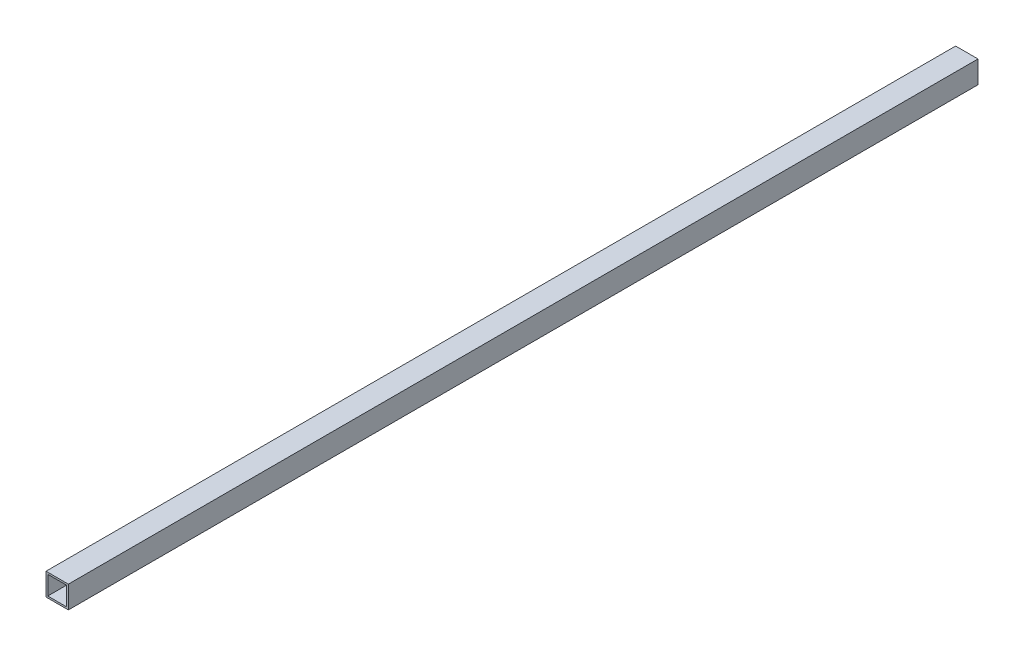
ISO-10303-21;
HEADER;
FILE_DESCRIPTION(('STEP AP214'),'2;1');
FILE_NAME('part.step','',(''),(''),'','','');
FILE_SCHEMA(('AUTOMOTIVE_DESIGN { 1 0 10303 214 1 1 1 1 }'));
ENDSEC;
DATA;
#1=APPLICATION_CONTEXT('core data for automotive mechanical design processes');
#2=APPLICATION_PROTOCOL_DEFINITION('international standard','automotive_design',2000,#1);
#3=PRODUCT_CONTEXT('',#1,'mechanical');
#4=PRODUCT('Part','Part','',(#3));
#5=PRODUCT_RELATED_PRODUCT_CATEGORY('part','',(#4));
#6=PRODUCT_DEFINITION_FORMATION('','',#4);
#7=PRODUCT_DEFINITION_CONTEXT('part definition',#1,'design');
#8=PRODUCT_DEFINITION('design','',#6,#7);
#9=PRODUCT_DEFINITION_SHAPE('','',#8);
#10=(LENGTH_UNIT() NAMED_UNIT(*) SI_UNIT(.MILLI.,.METRE.));
#11=(NAMED_UNIT(*) PLANE_ANGLE_UNIT() SI_UNIT($,.RADIAN.));
#12=(NAMED_UNIT(*) SI_UNIT($,.STERADIAN.) SOLID_ANGLE_UNIT());
#13=UNCERTAINTY_MEASURE_WITH_UNIT(LENGTH_MEASURE(1.E-05),#10,'distance_accuracy_value','');
#14=(GEOMETRIC_REPRESENTATION_CONTEXT(3) GLOBAL_UNCERTAINTY_ASSIGNED_CONTEXT((#13)) GLOBAL_UNIT_ASSIGNED_CONTEXT((#10,
#11,#12)) REPRESENTATION_CONTEXT('',''));
#15=CARTESIAN_POINT('',(0.,0.,0.));
#16=DIRECTION('',(0.,0.,1.));
#17=DIRECTION('',(1.,0.,0.));
#18=AXIS2_PLACEMENT_3D('',#15,#16,#17);
#19=CARTESIAN_POINT('',(0.,0.,610.));
#20=DIRECTION('',(0.,0.,-1.));
#21=DIRECTION('',(-1.,0.,0.));
#22=AXIS2_PLACEMENT_3D('',#19,#20,#21);
#23=PLANE('',#22);
#24=DIRECTION('',(0.,1.,0.));
#25=VECTOR('',#24,1.);
#26=CARTESIAN_POINT('',(7.5,-7.5,610.));
#27=LINE('',#26,#25);
#28=CARTESIAN_POINT('',(7.5,-7.5,610.));
#29=VERTEX_POINT('',#28);
#30=CARTESIAN_POINT('',(7.5,7.5,610.));
#31=VERTEX_POINT('',#30);
#32=EDGE_CURVE('E153',#29,#31,#27,.T.);
#33=ORIENTED_EDGE('',*,*,#32,.T.);
#34=DIRECTION('',(-1.,0.,0.));
#35=VECTOR('',#34,1.);
#36=CARTESIAN_POINT('',(-7.5,7.5,610.));
#37=LINE('',#36,#35);
#38=CARTESIAN_POINT('',(-7.5,7.5,610.));
#39=VERTEX_POINT('',#38);
#40=EDGE_CURVE('E157',#31,#39,#37,.T.);
#41=ORIENTED_EDGE('',*,*,#40,.T.);
#42=DIRECTION('',(0.,-1.,0.));
#43=VECTOR('',#42,1.);
#44=CARTESIAN_POINT('',(-7.5,-7.5,610.));
#45=LINE('',#44,#43);
#46=CARTESIAN_POINT('',(-7.5,-7.5,610.));
#47=VERTEX_POINT('',#46);
#48=EDGE_CURVE('E161',#39,#47,#45,.T.);
#49=ORIENTED_EDGE('',*,*,#48,.T.);
#50=DIRECTION('',(1.,0.,0.));
#51=VECTOR('',#50,1.);
#52=CARTESIAN_POINT('',(-7.5,-7.5,610.));
#53=LINE('',#52,#51);
#54=EDGE_CURVE('E164',#47,#29,#53,.T.);
#55=ORIENTED_EDGE('',*,*,#54,.T.);
#56=EDGE_LOOP('',(#33,#41,#49,#55));
#57=FACE_BOUND('',#56,.T.);
#58=DIRECTION('',(1.,0.,0.));
#59=VECTOR('',#58,1.);
#60=CARTESIAN_POINT('',(-6.3,-6.3,610.));
#61=LINE('',#60,#59);
#62=CARTESIAN_POINT('',(-6.3,-6.3,610.));
#63=VERTEX_POINT('',#62);
#64=CARTESIAN_POINT('',(6.3,-6.3,610.));
#65=VERTEX_POINT('',#64);
#66=EDGE_CURVE('E105',#63,#65,#61,.T.);
#67=ORIENTED_EDGE('',*,*,#66,.F.);
#68=DIRECTION('',(0.,-1.,0.));
#69=VECTOR('',#68,1.);
#70=CARTESIAN_POINT('',(-6.3,-6.3,610.));
#71=LINE('',#70,#69);
#72=CARTESIAN_POINT('',(-6.3,6.3,610.));
#73=VERTEX_POINT('',#72);
#74=EDGE_CURVE('E131',#73,#63,#71,.T.);
#75=ORIENTED_EDGE('',*,*,#74,.F.);
#76=DIRECTION('',(-1.,0.,0.));
#77=VECTOR('',#76,1.);
#78=CARTESIAN_POINT('',(-6.3,6.3,610.));
#79=LINE('',#78,#77);
#80=CARTESIAN_POINT('',(6.3,6.3,610.));
#81=VERTEX_POINT('',#80);
#82=EDGE_CURVE('E127',#81,#73,#79,.T.);
#83=ORIENTED_EDGE('',*,*,#82,.F.);
#84=DIRECTION('',(0.,1.,0.));
#85=VECTOR('',#84,1.);
#86=CARTESIAN_POINT('',(6.3,-6.3,610.));
#87=LINE('',#86,#85);
#88=EDGE_CURVE('E114',#65,#81,#87,.T.);
#89=ORIENTED_EDGE('',*,*,#88,.F.);
#90=EDGE_LOOP('',(#67,#75,#83,#89));
#91=FACE_BOUND('',#90,.T.);
#92=ADVANCED_FACE('F39',(#57,#91),#23,.F.);
#93=CARTESIAN_POINT('',(0.,0.,0.));
#94=DIRECTION('',(0.,0.,-1.));
#95=DIRECTION('',(-1.,0.,0.));
#96=AXIS2_PLACEMENT_3D('',#93,#94,#95);
#97=PLANE('',#96);
#98=DIRECTION('',(0.,1.,0.));
#99=VECTOR('',#98,1.);
#100=CARTESIAN_POINT('',(7.5,-7.5,0.));
#101=LINE('',#100,#99);
#102=CARTESIAN_POINT('',(7.5,-7.5,0.));
#103=VERTEX_POINT('',#102);
#104=CARTESIAN_POINT('',(7.5,7.5,0.));
#105=VERTEX_POINT('',#104);
#106=EDGE_CURVE('E123',#103,#105,#101,.T.);
#107=ORIENTED_EDGE('',*,*,#106,.F.);
#108=DIRECTION('',(1.,0.,0.));
#109=VECTOR('',#108,1.);
#110=CARTESIAN_POINT('',(-7.5,-7.5,0.));
#111=LINE('',#110,#109);
#112=CARTESIAN_POINT('',(-7.5,-7.5,0.));
#113=VERTEX_POINT('',#112);
#114=EDGE_CURVE('E158',#113,#103,#111,.T.);
#115=ORIENTED_EDGE('',*,*,#114,.F.);
#116=DIRECTION('',(0.,-1.,0.));
#117=VECTOR('',#116,1.);
#118=CARTESIAN_POINT('',(-7.5,-7.5,0.));
#119=LINE('',#118,#117);
#120=CARTESIAN_POINT('',(-7.5,7.5,0.));
#121=VERTEX_POINT('',#120);
#122=EDGE_CURVE('E174',#121,#113,#119,.T.);
#123=ORIENTED_EDGE('',*,*,#122,.F.);
#124=DIRECTION('',(-1.,0.,0.));
#125=VECTOR('',#124,1.);
#126=CARTESIAN_POINT('',(-7.5,7.5,0.));
#127=LINE('',#126,#125);
#128=EDGE_CURVE('E171',#105,#121,#127,.T.);
#129=ORIENTED_EDGE('',*,*,#128,.F.);
#130=EDGE_LOOP('',(#107,#115,#123,#129));
#131=FACE_BOUND('',#130,.T.);
#132=DIRECTION('',(0.,-1.,0.));
#133=VECTOR('',#132,1.);
#134=CARTESIAN_POINT('',(-6.3,-6.3,0.));
#135=LINE('',#134,#133);
#136=CARTESIAN_POINT('',(-6.3,6.3,0.));
#137=VERTEX_POINT('',#136);
#138=CARTESIAN_POINT('',(-6.3,-6.3,0.));
#139=VERTEX_POINT('',#138);
#140=EDGE_CURVE('E115',#137,#139,#135,.T.);
#141=ORIENTED_EDGE('',*,*,#140,.T.);
#142=DIRECTION('',(1.,0.,0.));
#143=VECTOR('',#142,1.);
#144=CARTESIAN_POINT('',(-6.3,-6.3,0.));
#145=LINE('',#144,#143);
#146=CARTESIAN_POINT('',(6.3,-6.3,0.));
#147=VERTEX_POINT('',#146);
#148=EDGE_CURVE('E63',#139,#147,#145,.T.);
#149=ORIENTED_EDGE('',*,*,#148,.T.);
#150=DIRECTION('',(0.,1.,0.));
#151=VECTOR('',#150,1.);
#152=CARTESIAN_POINT('',(6.3,-6.3,0.));
#153=LINE('',#152,#151);
#154=CARTESIAN_POINT('',(6.3,6.3,0.));
#155=VERTEX_POINT('',#154);
#156=EDGE_CURVE('E121',#147,#155,#153,.T.);
#157=ORIENTED_EDGE('',*,*,#156,.T.);
#158=DIRECTION('',(-1.,0.,0.));
#159=VECTOR('',#158,1.);
#160=CARTESIAN_POINT('',(-6.3,6.3,0.));
#161=LINE('',#160,#159);
#162=EDGE_CURVE('E140',#155,#137,#161,.T.);
#163=ORIENTED_EDGE('',*,*,#162,.T.);
#164=EDGE_LOOP('',(#141,#149,#157,#163));
#165=FACE_BOUND('',#164,.T.);
#166=ADVANCED_FACE('F197',(#131,#165),#97,.T.);
#167=CARTESIAN_POINT('',(7.5,-7.5,610.));
#168=DIRECTION('',(-1.,0.,0.));
#169=DIRECTION('',(0.,0.,1.));
#170=AXIS2_PLACEMENT_3D('',#167,#168,#169);
#171=PLANE('',#170);
#172=ORIENTED_EDGE('',*,*,#106,.T.);
#173=DIRECTION('',(0.,0.,-1.));
#174=VECTOR('',#173,1.);
#175=CARTESIAN_POINT('',(7.5,7.5,610.));
#176=LINE('',#175,#174);
#177=EDGE_CURVE('E11',#31,#105,#176,.T.);
#178=ORIENTED_EDGE('',*,*,#177,.F.);
#179=ORIENTED_EDGE('',*,*,#32,.F.);
#180=DIRECTION('',(0.,0.,-1.));
#181=VECTOR('',#180,1.);
#182=CARTESIAN_POINT('',(7.5,-7.5,610.));
#183=LINE('',#182,#181);
#184=EDGE_CURVE('E167',#29,#103,#183,.T.);
#185=ORIENTED_EDGE('',*,*,#184,.T.);
#186=EDGE_LOOP('',(#172,#178,#179,#185));
#187=FACE_BOUND('',#186,.T.);
#188=ADVANCED_FACE('F41',(#187),#171,.F.);
#189=CARTESIAN_POINT('',(-7.5,7.5,610.));
#190=DIRECTION('',(0.,-1.,0.));
#191=DIRECTION('',(0.,0.,-1.));
#192=AXIS2_PLACEMENT_3D('',#189,#190,#191);
#193=PLANE('',#192);
#194=ORIENTED_EDGE('',*,*,#128,.T.);
#195=DIRECTION('',(0.,0.,-1.));
#196=VECTOR('',#195,1.);
#197=CARTESIAN_POINT('',(-7.5,7.5,610.));
#198=LINE('',#197,#196);
#199=EDGE_CURVE('E48',#39,#121,#198,.T.);
#200=ORIENTED_EDGE('',*,*,#199,.F.);
#201=ORIENTED_EDGE('',*,*,#40,.F.);
#202=ORIENTED_EDGE('',*,*,#177,.T.);
#203=EDGE_LOOP('',(#194,#200,#201,#202));
#204=FACE_BOUND('',#203,.T.);
#205=ADVANCED_FACE('F207',(#204),#193,.F.);
#206=CARTESIAN_POINT('',(-7.5,-7.5,610.));
#207=DIRECTION('',(1.,0.,0.));
#208=DIRECTION('',(0.,0.,-1.));
#209=AXIS2_PLACEMENT_3D('',#206,#207,#208);
#210=PLANE('',#209);
#211=ORIENTED_EDGE('',*,*,#122,.T.);
#212=DIRECTION('',(0.,0.,-1.));
#213=VECTOR('',#212,1.);
#214=CARTESIAN_POINT('',(-7.5,-7.5,610.));
#215=LINE('',#214,#213);
#216=EDGE_CURVE('E182',#47,#113,#215,.T.);
#217=ORIENTED_EDGE('',*,*,#216,.F.);
#218=ORIENTED_EDGE('',*,*,#48,.F.);
#219=ORIENTED_EDGE('',*,*,#199,.T.);
#220=EDGE_LOOP('',(#211,#217,#218,#219));
#221=FACE_BOUND('',#220,.T.);
#222=ADVANCED_FACE('F191',(#221),#210,.F.);
#223=CARTESIAN_POINT('',(-7.5,-7.5,610.));
#224=DIRECTION('',(0.,1.,0.));
#225=DIRECTION('',(0.,0.,1.));
#226=AXIS2_PLACEMENT_3D('',#223,#224,#225);
#227=PLANE('',#226);
#228=ORIENTED_EDGE('',*,*,#114,.T.);
#229=ORIENTED_EDGE('',*,*,#184,.F.);
#230=ORIENTED_EDGE('',*,*,#54,.F.);
#231=ORIENTED_EDGE('',*,*,#216,.T.);
#232=EDGE_LOOP('',(#228,#229,#230,#231));
#233=FACE_BOUND('',#232,.T.);
#234=ADVANCED_FACE('F201',(#233),#227,.F.);
#235=CARTESIAN_POINT('',(-6.3,-6.3,610.));
#236=DIRECTION('',(0.,1.,0.));
#237=DIRECTION('',(0.,0.,1.));
#238=AXIS2_PLACEMENT_3D('',#235,#236,#237);
#239=PLANE('',#238);
#240=ORIENTED_EDGE('',*,*,#148,.F.);
#241=DIRECTION('',(0.,0.,-1.));
#242=VECTOR('',#241,1.);
#243=CARTESIAN_POINT('',(-6.3,-6.3,610.));
#244=LINE('',#243,#242);
#245=EDGE_CURVE('E109',#63,#139,#244,.T.);
#246=ORIENTED_EDGE('',*,*,#245,.F.);
#247=ORIENTED_EDGE('',*,*,#66,.T.);
#248=DIRECTION('',(0.,0.,-1.));
#249=VECTOR('',#248,1.);
#250=CARTESIAN_POINT('',(6.3,-6.3,610.));
#251=LINE('',#250,#249);
#252=EDGE_CURVE('E108',#65,#147,#251,.T.);
#253=ORIENTED_EDGE('',*,*,#252,.T.);
#254=EDGE_LOOP('',(#240,#246,#247,#253));
#255=FACE_BOUND('',#254,.T.);
#256=ADVANCED_FACE('F107',(#255),#239,.T.);
#257=CARTESIAN_POINT('',(6.3,-6.3,610.));
#258=DIRECTION('',(-1.,0.,0.));
#259=DIRECTION('',(0.,0.,1.));
#260=AXIS2_PLACEMENT_3D('',#257,#258,#259);
#261=PLANE('',#260);
#262=ORIENTED_EDGE('',*,*,#156,.F.);
#263=ORIENTED_EDGE('',*,*,#252,.F.);
#264=ORIENTED_EDGE('',*,*,#88,.T.);
#265=DIRECTION('',(0.,0.,-1.));
#266=VECTOR('',#265,1.);
#267=CARTESIAN_POINT('',(6.3,6.3,610.));
#268=LINE('',#267,#266);
#269=EDGE_CURVE('E124',#81,#155,#268,.T.);
#270=ORIENTED_EDGE('',*,*,#269,.T.);
#271=EDGE_LOOP('',(#262,#263,#264,#270));
#272=FACE_BOUND('',#271,.T.);
#273=ADVANCED_FACE('F118',(#272),#261,.T.);
#274=CARTESIAN_POINT('',(-6.3,6.3,610.));
#275=DIRECTION('',(0.,-1.,0.));
#276=DIRECTION('',(0.,0.,-1.));
#277=AXIS2_PLACEMENT_3D('',#274,#275,#276);
#278=PLANE('',#277);
#279=ORIENTED_EDGE('',*,*,#162,.F.);
#280=ORIENTED_EDGE('',*,*,#269,.F.);
#281=ORIENTED_EDGE('',*,*,#82,.T.);
#282=DIRECTION('',(0.,0.,-1.));
#283=VECTOR('',#282,1.);
#284=CARTESIAN_POINT('',(-6.3,6.3,610.));
#285=LINE('',#284,#283);
#286=EDGE_CURVE('E55',#73,#137,#285,.T.);
#287=ORIENTED_EDGE('',*,*,#286,.T.);
#288=EDGE_LOOP('',(#279,#280,#281,#287));
#289=FACE_BOUND('',#288,.T.);
#290=ADVANCED_FACE('F230',(#289),#278,.T.);
#291=CARTESIAN_POINT('',(-6.3,-6.3,610.));
#292=DIRECTION('',(1.,0.,0.));
#293=DIRECTION('',(0.,0.,-1.));
#294=AXIS2_PLACEMENT_3D('',#291,#292,#293);
#295=PLANE('',#294);
#296=ORIENTED_EDGE('',*,*,#140,.F.);
#297=ORIENTED_EDGE('',*,*,#286,.F.);
#298=ORIENTED_EDGE('',*,*,#74,.T.);
#299=ORIENTED_EDGE('',*,*,#245,.T.);
#300=EDGE_LOOP('',(#296,#297,#298,#299));
#301=FACE_BOUND('',#300,.T.);
#302=ADVANCED_FACE('F234',(#301),#295,.T.);
#303=CLOSED_SHELL('',(#92,#166,#188,#205,#222,#234,#256,#273,#290,#302));
#304=MANIFOLD_SOLID_BREP('B2',#303);
#305=ADVANCED_BREP_SHAPE_REPRESENTATION('',(#18,#304),#14);
#306=SHAPE_DEFINITION_REPRESENTATION(#9,#305);
ENDSEC;
END-ISO-10303-21;
